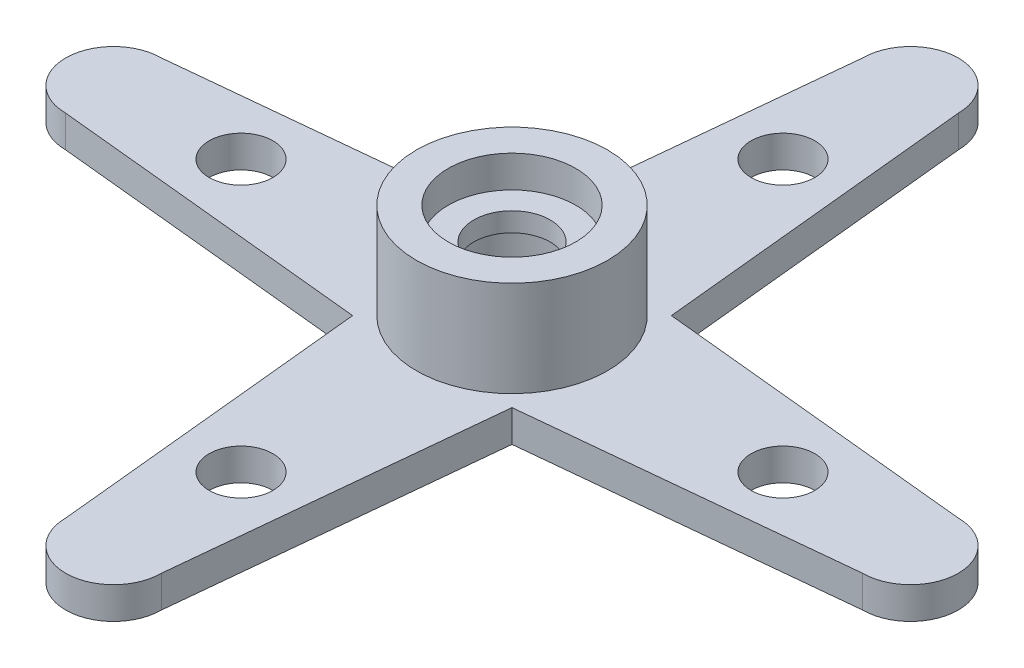
ISO-10303-21;
HEADER;
FILE_DESCRIPTION(('STEP AP214'),'2;1');
FILE_NAME('part.step','',(''),(''),'','','');
FILE_SCHEMA(('AUTOMOTIVE_DESIGN { 1 0 10303 214 1 1 1 1 }'));
ENDSEC;
DATA;
#1=APPLICATION_CONTEXT('core data for automotive mechanical design processes');
#2=APPLICATION_PROTOCOL_DEFINITION('international standard','automotive_design',2000,#1);
#3=PRODUCT_CONTEXT('',#1,'mechanical');
#4=PRODUCT('Part','Part','',(#3));
#5=PRODUCT_RELATED_PRODUCT_CATEGORY('part','',(#4));
#6=PRODUCT_DEFINITION_FORMATION('','',#4);
#7=PRODUCT_DEFINITION_CONTEXT('part definition',#1,'design');
#8=PRODUCT_DEFINITION('design','',#6,#7);
#9=PRODUCT_DEFINITION_SHAPE('','',#8);
#10=(LENGTH_UNIT() NAMED_UNIT(*) SI_UNIT(.MILLI.,.METRE.));
#11=(NAMED_UNIT(*) PLANE_ANGLE_UNIT() SI_UNIT($,.RADIAN.));
#12=(NAMED_UNIT(*) SI_UNIT($,.STERADIAN.) SOLID_ANGLE_UNIT());
#13=UNCERTAINTY_MEASURE_WITH_UNIT(LENGTH_MEASURE(1.E-05),#10,'distance_accuracy_value','');
#14=(GEOMETRIC_REPRESENTATION_CONTEXT(3) GLOBAL_UNCERTAINTY_ASSIGNED_CONTEXT((#13)) GLOBAL_UNIT_ASSIGNED_CONTEXT((#10,
#11,#12)) REPRESENTATION_CONTEXT('',''));
#15=CARTESIAN_POINT('',(0.,0.,0.));
#16=DIRECTION('',(0.,0.,1.));
#17=DIRECTION('',(1.,0.,0.));
#18=AXIS2_PLACEMENT_3D('',#15,#16,#17);
#19=CARTESIAN_POINT('',(0.,2.5,0.));
#20=DIRECTION('',(0.,-1.,0.));
#21=DIRECTION('',(0.,0.,-1.));
#22=AXIS2_PLACEMENT_3D('',#19,#20,#21);
#23=CYLINDRICAL_SURFACE('',#22,10.);
#24=CARTESIAN_POINT('',(0.,-2.5,0.));
#25=DIRECTION('',(0.,1.,0.));
#26=DIRECTION('',(0.,0.,1.));
#27=AXIS2_PLACEMENT_3D('',#24,#25,#26);
#28=CIRCLE('',#27,10.);
#29=CARTESIAN_POINT('',(0.,-2.5,10.));
#30=VERTEX_POINT('',#29);
#31=EDGE_CURVE('E163',#30,#30,#28,.T.);
#32=ORIENTED_EDGE('',*,*,#31,.F.);
#33=EDGE_LOOP('',(#32));
#34=FACE_BOUND('',#33,.T.);
#35=CARTESIAN_POINT('',(0.,9.5,0.));
#36=DIRECTION('',(0.,1.,0.));
#37=DIRECTION('',(0.,0.,1.));
#38=AXIS2_PLACEMENT_3D('',#35,#36,#37);
#39=CIRCLE('',#38,10.);
#40=CARTESIAN_POINT('',(0.,9.5,10.));
#41=VERTEX_POINT('',#40);
#42=EDGE_CURVE('E319',#41,#41,#39,.T.);
#43=ORIENTED_EDGE('',*,*,#42,.T.);
#44=EDGE_LOOP('',(#43));
#45=FACE_BOUND('',#44,.T.);
#46=ADVANCED_FACE('F36',(#34,#45),#23,.F.);
#47=CARTESIAN_POINT('',(62.5,2.5,0.));
#48=DIRECTION('',(0.,-1.,0.));
#49=DIRECTION('',(0.,0.,-1.));
#50=AXIS2_PLACEMENT_3D('',#47,#48,#49);
#51=PLANE('',#50);
#52=CARTESIAN_POINT('',(42.5,2.5,0.));
#53=DIRECTION('',(0.,1.,0.));
#54=DIRECTION('',(0.,0.,1.));
#55=AXIS2_PLACEMENT_3D('',#52,#53,#54);
#56=CIRCLE('',#55,5.);
#57=CARTESIAN_POINT('',(42.5,2.5,4.99999999999999));
#58=VERTEX_POINT('',#57);
#59=EDGE_CURVE('E334',#58,#58,#56,.T.);
#60=ORIENTED_EDGE('',*,*,#59,.F.);
#61=EDGE_LOOP('',(#60));
#62=FACE_BOUND('',#61,.T.);
#63=CARTESIAN_POINT('',(-42.5,2.5,0.));
#64=DIRECTION('',(0.,1.,0.));
#65=DIRECTION('',(0.,0.,1.));
#66=AXIS2_PLACEMENT_3D('',#63,#64,#65);
#67=CIRCLE('',#66,5.);
#68=CARTESIAN_POINT('',(-42.5,2.5,5.));
#69=VERTEX_POINT('',#68);
#70=EDGE_CURVE('E328',#69,#69,#67,.T.);
#71=ORIENTED_EDGE('',*,*,#70,.F.);
#72=EDGE_LOOP('',(#71));
#73=FACE_BOUND('',#72,.T.);
#74=CARTESIAN_POINT('',(0.,2.5,-42.5));
#75=DIRECTION('',(0.,1.,0.));
#76=DIRECTION('',(0.,0.,1.));
#77=AXIS2_PLACEMENT_3D('',#74,#75,#76);
#78=CIRCLE('',#77,5.);
#79=CARTESIAN_POINT('',(0.,2.5,-37.5));
#80=VERTEX_POINT('',#79);
#81=EDGE_CURVE('E322',#80,#80,#78,.T.);
#82=ORIENTED_EDGE('',*,*,#81,.F.);
#83=EDGE_LOOP('',(#82));
#84=FACE_BOUND('',#83,.T.);
#85=CARTESIAN_POINT('',(0.,2.5,42.5));
#86=DIRECTION('',(0.,1.,0.));
#87=DIRECTION('',(0.,0.,-1.));
#88=AXIS2_PLACEMENT_3D('',#85,#86,#87);
#89=CIRCLE('',#88,5.);
#90=CARTESIAN_POINT('',(0.,2.5,37.5));
#91=VERTEX_POINT('',#90);
#92=EDGE_CURVE('E315',#91,#91,#89,.T.);
#93=ORIENTED_EDGE('',*,*,#92,.F.);
#94=EDGE_LOOP('',(#93));
#95=FACE_BOUND('',#94,.T.);
#96=DIRECTION('',(-0.0995037190209994,0.,-0.995037190209989));
#97=VECTOR('',#96,1.);
#98=CARTESIAN_POINT('',(7.5,2.5,-62.5));
#99=LINE('',#98,#97);
#100=CARTESIAN_POINT('',(12.5,2.5,-12.5));
#101=VERTEX_POINT('',#100);
#102=CARTESIAN_POINT('',(7.5,2.5,-62.5));
#103=VERTEX_POINT('',#102);
#104=EDGE_CURVE('E182',#101,#103,#99,.T.);
#105=ORIENTED_EDGE('',*,*,#104,.T.);
#106=CARTESIAN_POINT('',(0.,2.5,-62.5));
#107=DIRECTION('',(0.,1.,0.));
#108=DIRECTION('',(0.,0.,-1.));
#109=AXIS2_PLACEMENT_3D('',#106,#107,#108);
#110=CIRCLE('',#109,7.5);
#111=CARTESIAN_POINT('',(-7.5,2.5,-62.5));
#112=VERTEX_POINT('',#111);
#113=EDGE_CURVE('E109',#103,#112,#110,.T.);
#114=ORIENTED_EDGE('',*,*,#113,.T.);
#115=DIRECTION('',(-0.0995037190209991,0.,0.995037190209989));
#116=VECTOR('',#115,1.);
#117=CARTESIAN_POINT('',(-7.5,2.5,-62.5));
#118=LINE('',#117,#116);
#119=CARTESIAN_POINT('',(-12.5,2.5,-12.5));
#120=VERTEX_POINT('',#119);
#121=EDGE_CURVE('E275',#112,#120,#118,.T.);
#122=ORIENTED_EDGE('',*,*,#121,.T.);
#123=DIRECTION('',(-0.995037190209989,0.,0.099503719020999));
#124=VECTOR('',#123,1.);
#125=CARTESIAN_POINT('',(-12.5,2.5,-12.5));
#126=LINE('',#125,#124);
#127=CARTESIAN_POINT('',(-62.5,2.5,-7.5));
#128=VERTEX_POINT('',#127);
#129=EDGE_CURVE('E287',#120,#128,#126,.T.);
#130=ORIENTED_EDGE('',*,*,#129,.T.);
#131=CARTESIAN_POINT('',(-62.5,2.5,0.));
#132=DIRECTION('',(0.,1.,0.));
#133=DIRECTION('',(0.,0.,-1.));
#134=AXIS2_PLACEMENT_3D('',#131,#132,#133);
#135=CIRCLE('',#134,7.5);
#136=CARTESIAN_POINT('',(-62.5,2.5,7.5));
#137=VERTEX_POINT('',#136);
#138=EDGE_CURVE('E284',#128,#137,#135,.T.);
#139=ORIENTED_EDGE('',*,*,#138,.T.);
#140=DIRECTION('',(0.995037190209989,0.,0.099503719020999));
#141=VECTOR('',#140,1.);
#142=CARTESIAN_POINT('',(-62.5,2.5,7.5));
#143=LINE('',#142,#141);
#144=CARTESIAN_POINT('',(-12.5,2.5,12.5));
#145=VERTEX_POINT('',#144);
#146=EDGE_CURVE('E286',#137,#145,#143,.T.);
#147=ORIENTED_EDGE('',*,*,#146,.T.);
#148=DIRECTION('',(0.0995037190209991,0.,0.995037190209989));
#149=VECTOR('',#148,1.);
#150=CARTESIAN_POINT('',(-7.50000000000001,2.5,62.5));
#151=LINE('',#150,#149);
#152=CARTESIAN_POINT('',(-7.5,2.5,62.5));
#153=VERTEX_POINT('',#152);
#154=EDGE_CURVE('E289',#145,#153,#151,.T.);
#155=ORIENTED_EDGE('',*,*,#154,.T.);
#156=CARTESIAN_POINT('',(0.,2.5,62.5));
#157=DIRECTION('',(0.,1.,0.));
#158=DIRECTION('',(0.,0.,1.));
#159=AXIS2_PLACEMENT_3D('',#156,#157,#158);
#160=CIRCLE('',#159,7.49999999999999);
#161=CARTESIAN_POINT('',(7.49999999999997,2.5,62.5));
#162=VERTEX_POINT('',#161);
#163=EDGE_CURVE('E295',#153,#162,#160,.T.);
#164=ORIENTED_EDGE('',*,*,#163,.T.);
#165=DIRECTION('',(0.0995037190209994,0.,-0.995037190209989));
#166=VECTOR('',#165,1.);
#167=CARTESIAN_POINT('',(7.49999999999997,2.5,62.5));
#168=LINE('',#167,#166);
#169=CARTESIAN_POINT('',(12.5,2.5,12.5));
#170=VERTEX_POINT('',#169);
#171=EDGE_CURVE('E141',#162,#170,#168,.T.);
#172=ORIENTED_EDGE('',*,*,#171,.T.);
#173=DIRECTION('',(0.995037190209989,0.,-0.099503719020999));
#174=VECTOR('',#173,1.);
#175=CARTESIAN_POINT('',(62.5,2.5,7.5));
#176=LINE('',#175,#174);
#177=CARTESIAN_POINT('',(62.5,2.5,7.5));
#178=VERTEX_POINT('',#177);
#179=EDGE_CURVE('E134',#170,#178,#176,.T.);
#180=ORIENTED_EDGE('',*,*,#179,.T.);
#181=CARTESIAN_POINT('',(62.5,2.5,0.));
#182=DIRECTION('',(0.,1.,0.));
#183=DIRECTION('',(0.,0.,-1.));
#184=AXIS2_PLACEMENT_3D('',#181,#182,#183);
#185=CIRCLE('',#184,7.5);
#186=CARTESIAN_POINT('',(62.5,2.5,-7.5));
#187=VERTEX_POINT('',#186);
#188=EDGE_CURVE('E139',#178,#187,#185,.T.);
#189=ORIENTED_EDGE('',*,*,#188,.T.);
#190=DIRECTION('',(-0.995037190209989,0.,-0.099503719020999));
#191=VECTOR('',#190,1.);
#192=CARTESIAN_POINT('',(12.5,2.5,-12.5));
#193=LINE('',#192,#191);
#194=EDGE_CURVE('E53',#187,#101,#193,.T.);
#195=ORIENTED_EDGE('',*,*,#194,.T.);
#196=EDGE_LOOP('',(#105,#114,#122,#130,#139,#147,#155,#164,#172,#180,#189,#195));
#197=FACE_BOUND('',#196,.T.);
#198=CARTESIAN_POINT('',(0.,2.5,0.));
#199=DIRECTION('',(0.,-1.,0.));
#200=DIRECTION('',(0.,0.,-1.));
#201=AXIS2_PLACEMENT_3D('',#198,#199,#200);
#202=CIRCLE('',#201,15.);
#203=CARTESIAN_POINT('',(0.,2.5,-15.));
#204=VERTEX_POINT('',#203);
#205=EDGE_CURVE('E45',#204,#204,#202,.F.);
#206=ORIENTED_EDGE('',*,*,#205,.F.);
#207=EDGE_LOOP('',(#206));
#208=FACE_BOUND('',#207,.T.);
#209=ADVANCED_FACE('F136',(#62,#73,#84,#95,#197,#208),#51,.F.);
#210=CARTESIAN_POINT('',(62.5,-2.5,0.));
#211=DIRECTION('',(0.,-1.,0.));
#212=DIRECTION('',(0.,0.,-1.));
#213=AXIS2_PLACEMENT_3D('',#210,#211,#212);
#214=PLANE('',#213);
#215=CARTESIAN_POINT('',(42.5,-2.5,0.));
#216=DIRECTION('',(0.,1.,0.));
#217=DIRECTION('',(0.,0.,1.));
#218=AXIS2_PLACEMENT_3D('',#215,#216,#217);
#219=CIRCLE('',#218,5.);
#220=CARTESIAN_POINT('',(42.5,-2.5,4.99999999999999));
#221=VERTEX_POINT('',#220);
#222=EDGE_CURVE('E314',#221,#221,#219,.T.);
#223=ORIENTED_EDGE('',*,*,#222,.T.);
#224=EDGE_LOOP('',(#223));
#225=FACE_BOUND('',#224,.T.);
#226=CARTESIAN_POINT('',(-42.5,-2.5,0.));
#227=DIRECTION('',(0.,1.,0.));
#228=DIRECTION('',(0.,0.,1.));
#229=AXIS2_PLACEMENT_3D('',#226,#227,#228);
#230=CIRCLE('',#229,5.);
#231=CARTESIAN_POINT('',(-42.5,-2.5,5.));
#232=VERTEX_POINT('',#231);
#233=EDGE_CURVE('E331',#232,#232,#230,.T.);
#234=ORIENTED_EDGE('',*,*,#233,.T.);
#235=EDGE_LOOP('',(#234));
#236=FACE_BOUND('',#235,.T.);
#237=CARTESIAN_POINT('',(0.,-2.5,-42.5));
#238=DIRECTION('',(0.,1.,0.));
#239=DIRECTION('',(0.,0.,1.));
#240=AXIS2_PLACEMENT_3D('',#237,#238,#239);
#241=CIRCLE('',#240,5.);
#242=CARTESIAN_POINT('',(0.,-2.5,-37.5));
#243=VERTEX_POINT('',#242);
#244=EDGE_CURVE('E325',#243,#243,#241,.T.);
#245=ORIENTED_EDGE('',*,*,#244,.T.);
#246=EDGE_LOOP('',(#245));
#247=FACE_BOUND('',#246,.T.);
#248=CARTESIAN_POINT('',(0.,-2.5,42.5));
#249=DIRECTION('',(0.,1.,0.));
#250=DIRECTION('',(0.,0.,-1.));
#251=AXIS2_PLACEMENT_3D('',#248,#249,#250);
#252=CIRCLE('',#251,5.);
#253=CARTESIAN_POINT('',(0.,-2.5,37.5));
#254=VERTEX_POINT('',#253);
#255=EDGE_CURVE('E318',#254,#254,#252,.T.);
#256=ORIENTED_EDGE('',*,*,#255,.T.);
#257=EDGE_LOOP('',(#256));
#258=FACE_BOUND('',#257,.T.);
#259=DIRECTION('',(-0.0995037190209994,0.,-0.995037190209989));
#260=VECTOR('',#259,1.);
#261=CARTESIAN_POINT('',(7.5,-2.5,-62.5));
#262=LINE('',#261,#260);
#263=CARTESIAN_POINT('',(12.5,-2.5,-12.5));
#264=VERTEX_POINT('',#263);
#265=CARTESIAN_POINT('',(7.5,-2.5,-62.5));
#266=VERTEX_POINT('',#265);
#267=EDGE_CURVE('E159',#264,#266,#262,.T.);
#268=ORIENTED_EDGE('',*,*,#267,.F.);
#269=DIRECTION('',(-0.995037190209989,0.,-0.099503719020999));
#270=VECTOR('',#269,1.);
#271=CARTESIAN_POINT('',(12.5,-2.5,-12.5));
#272=LINE('',#271,#270);
#273=CARTESIAN_POINT('',(62.5,-2.5,-7.5));
#274=VERTEX_POINT('',#273);
#275=EDGE_CURVE('E100',#274,#264,#272,.T.);
#276=ORIENTED_EDGE('',*,*,#275,.F.);
#277=CARTESIAN_POINT('',(62.5,-2.5,0.));
#278=DIRECTION('',(0.,1.,0.));
#279=DIRECTION('',(0.,0.,-1.));
#280=AXIS2_PLACEMENT_3D('',#277,#278,#279);
#281=CIRCLE('',#280,7.5);
#282=CARTESIAN_POINT('',(62.5,-2.5,7.5));
#283=VERTEX_POINT('',#282);
#284=EDGE_CURVE('E94',#283,#274,#281,.T.);
#285=ORIENTED_EDGE('',*,*,#284,.F.);
#286=DIRECTION('',(0.995037190209989,0.,-0.099503719020999));
#287=VECTOR('',#286,1.);
#288=CARTESIAN_POINT('',(62.5,-2.5,7.5));
#289=LINE('',#288,#287);
#290=CARTESIAN_POINT('',(12.5,-2.5,12.5));
#291=VERTEX_POINT('',#290);
#292=EDGE_CURVE('E149',#291,#283,#289,.T.);
#293=ORIENTED_EDGE('',*,*,#292,.F.);
#294=DIRECTION('',(0.0995037190209994,0.,-0.995037190209989));
#295=VECTOR('',#294,1.);
#296=CARTESIAN_POINT('',(7.49999999999997,-2.5,62.5));
#297=LINE('',#296,#295);
#298=CARTESIAN_POINT('',(7.49999999999997,-2.5,62.5));
#299=VERTEX_POINT('',#298);
#300=EDGE_CURVE('E177',#299,#291,#297,.T.);
#301=ORIENTED_EDGE('',*,*,#300,.F.);
#302=CARTESIAN_POINT('',(0.,-2.5,62.5));
#303=DIRECTION('',(0.,1.,0.));
#304=DIRECTION('',(0.,0.,1.));
#305=AXIS2_PLACEMENT_3D('',#302,#303,#304);
#306=CIRCLE('',#305,7.49999999999999);
#307=CARTESIAN_POINT('',(-7.5,-2.5,62.5));
#308=VERTEX_POINT('',#307);
#309=EDGE_CURVE('E175',#308,#299,#306,.T.);
#310=ORIENTED_EDGE('',*,*,#309,.F.);
#311=DIRECTION('',(0.0995037190209991,0.,0.995037190209989));
#312=VECTOR('',#311,1.);
#313=CARTESIAN_POINT('',(-7.50000000000001,-2.5,62.5));
#314=LINE('',#313,#312);
#315=CARTESIAN_POINT('',(-12.5,-2.5,12.5));
#316=VERTEX_POINT('',#315);
#317=EDGE_CURVE('E173',#316,#308,#314,.T.);
#318=ORIENTED_EDGE('',*,*,#317,.F.);
#319=DIRECTION('',(0.995037190209989,0.,0.099503719020999));
#320=VECTOR('',#319,1.);
#321=CARTESIAN_POINT('',(-62.5,-2.5,7.5));
#322=LINE('',#321,#320);
#323=CARTESIAN_POINT('',(-62.5,-2.5,7.5));
#324=VERTEX_POINT('',#323);
#325=EDGE_CURVE('E171',#324,#316,#322,.T.);
#326=ORIENTED_EDGE('',*,*,#325,.F.);
#327=CARTESIAN_POINT('',(-62.5,-2.5,0.));
#328=DIRECTION('',(0.,1.,0.));
#329=DIRECTION('',(0.,0.,-1.));
#330=AXIS2_PLACEMENT_3D('',#327,#328,#329);
#331=CIRCLE('',#330,7.5);
#332=CARTESIAN_POINT('',(-62.5,-2.5,-7.5));
#333=VERTEX_POINT('',#332);
#334=EDGE_CURVE('E169',#333,#324,#331,.T.);
#335=ORIENTED_EDGE('',*,*,#334,.F.);
#336=DIRECTION('',(-0.995037190209989,0.,0.099503719020999));
#337=VECTOR('',#336,1.);
#338=CARTESIAN_POINT('',(-12.5,-2.5,-12.5));
#339=LINE('',#338,#337);
#340=CARTESIAN_POINT('',(-12.5,-2.5,-12.5));
#341=VERTEX_POINT('',#340);
#342=EDGE_CURVE('E167',#341,#333,#339,.T.);
#343=ORIENTED_EDGE('',*,*,#342,.F.);
#344=DIRECTION('',(-0.0995037190209991,0.,0.995037190209989));
#345=VECTOR('',#344,1.);
#346=CARTESIAN_POINT('',(-7.5,-2.5,-62.5));
#347=LINE('',#346,#345);
#348=CARTESIAN_POINT('',(-7.5,-2.5,-62.5));
#349=VERTEX_POINT('',#348);
#350=EDGE_CURVE('E165',#349,#341,#347,.T.);
#351=ORIENTED_EDGE('',*,*,#350,.F.);
#352=CARTESIAN_POINT('',(0.,-2.5,-62.5));
#353=DIRECTION('',(0.,1.,0.));
#354=DIRECTION('',(0.,0.,-1.));
#355=AXIS2_PLACEMENT_3D('',#352,#353,#354);
#356=CIRCLE('',#355,7.5);
#357=EDGE_CURVE('E162',#266,#349,#356,.T.);
#358=ORIENTED_EDGE('',*,*,#357,.F.);
#359=EDGE_LOOP('',(#268,#276,#285,#293,#301,#310,#318,#326,#335,#343,#351,#358));
#360=FACE_BOUND('',#359,.T.);
#361=ORIENTED_EDGE('',*,*,#31,.T.);
#362=EDGE_LOOP('',(#361));
#363=FACE_BOUND('',#362,.T.);
#364=ADVANCED_FACE('F213',(#225,#236,#247,#258,#360,#363),#214,.T.);
#365=CARTESIAN_POINT('',(7.5,2.5,-62.5));
#366=DIRECTION('',(-0.995037190209989,0.,0.0995037190209994));
#367=DIRECTION('',(0.0995037190209994,0.,0.995037190209989));
#368=AXIS2_PLACEMENT_3D('',#365,#366,#367);
#369=PLANE('',#368);
#370=ORIENTED_EDGE('',*,*,#267,.T.);
#371=DIRECTION('',(0.,-1.,0.));
#372=VECTOR('',#371,1.);
#373=CARTESIAN_POINT('',(7.5,2.5,-62.5));
#374=LINE('',#373,#372);
#375=EDGE_CURVE('E207',#103,#266,#374,.T.);
#376=ORIENTED_EDGE('',*,*,#375,.F.);
#377=ORIENTED_EDGE('',*,*,#104,.F.);
#378=DIRECTION('',(0.,-1.,0.));
#379=VECTOR('',#378,1.);
#380=CARTESIAN_POINT('',(12.5,2.5,-12.5));
#381=LINE('',#380,#379);
#382=EDGE_CURVE('E155',#101,#264,#381,.T.);
#383=ORIENTED_EDGE('',*,*,#382,.T.);
#384=EDGE_LOOP('',(#370,#376,#377,#383));
#385=FACE_BOUND('',#384,.T.);
#386=ADVANCED_FACE('F38',(#385),#369,.F.);
#387=CARTESIAN_POINT('',(0.,2.5,-62.5));
#388=DIRECTION('',(0.,-1.,0.));
#389=DIRECTION('',(0.,0.,-1.));
#390=AXIS2_PLACEMENT_3D('',#387,#388,#389);
#391=CYLINDRICAL_SURFACE('',#390,7.5);
#392=ORIENTED_EDGE('',*,*,#357,.T.);
#393=DIRECTION('',(0.,-1.,0.));
#394=VECTOR('',#393,1.);
#395=CARTESIAN_POINT('',(-7.5,2.5,-62.5));
#396=LINE('',#395,#394);
#397=EDGE_CURVE('E204',#112,#349,#396,.T.);
#398=ORIENTED_EDGE('',*,*,#397,.F.);
#399=ORIENTED_EDGE('',*,*,#113,.F.);
#400=ORIENTED_EDGE('',*,*,#375,.T.);
#401=EDGE_LOOP('',(#392,#398,#399,#400));
#402=FACE_BOUND('',#401,.T.);
#403=ADVANCED_FACE('F262',(#402),#391,.T.);
#404=CARTESIAN_POINT('',(-7.5,2.5,-62.5));
#405=DIRECTION('',(0.995037190209989,0.,0.0995037190209991));
#406=DIRECTION('',(0.0995037190209991,0.,-0.995037190209989));
#407=AXIS2_PLACEMENT_3D('',#404,#405,#406);
#408=PLANE('',#407);
#409=ORIENTED_EDGE('',*,*,#350,.T.);
#410=DIRECTION('',(0.,-1.,0.));
#411=VECTOR('',#410,1.);
#412=CARTESIAN_POINT('',(-12.5,2.5,-12.5));
#413=LINE('',#412,#411);
#414=EDGE_CURVE('E201',#120,#341,#413,.T.);
#415=ORIENTED_EDGE('',*,*,#414,.F.);
#416=ORIENTED_EDGE('',*,*,#121,.F.);
#417=ORIENTED_EDGE('',*,*,#397,.T.);
#418=EDGE_LOOP('',(#409,#415,#416,#417));
#419=FACE_BOUND('',#418,.T.);
#420=ADVANCED_FACE('F259',(#419),#408,.F.);
#421=CARTESIAN_POINT('',(-12.5,2.5,-12.5));
#422=DIRECTION('',(0.099503719020999,0.,0.995037190209989));
#423=DIRECTION('',(0.995037190209989,0.,-0.099503719020999));
#424=AXIS2_PLACEMENT_3D('',#421,#422,#423);
#425=PLANE('',#424);
#426=ORIENTED_EDGE('',*,*,#342,.T.);
#427=DIRECTION('',(0.,-1.,0.));
#428=VECTOR('',#427,1.);
#429=CARTESIAN_POINT('',(-62.5,2.5,-7.5));
#430=LINE('',#429,#428);
#431=EDGE_CURVE('E198',#128,#333,#430,.T.);
#432=ORIENTED_EDGE('',*,*,#431,.F.);
#433=ORIENTED_EDGE('',*,*,#129,.F.);
#434=ORIENTED_EDGE('',*,*,#414,.T.);
#435=EDGE_LOOP('',(#426,#432,#433,#434));
#436=FACE_BOUND('',#435,.T.);
#437=ADVANCED_FACE('F255',(#436),#425,.F.);
#438=CARTESIAN_POINT('',(-62.5,2.5,0.));
#439=DIRECTION('',(0.,-1.,0.));
#440=DIRECTION('',(0.,0.,-1.));
#441=AXIS2_PLACEMENT_3D('',#438,#439,#440);
#442=CYLINDRICAL_SURFACE('',#441,7.5);
#443=ORIENTED_EDGE('',*,*,#334,.T.);
#444=DIRECTION('',(0.,-1.,0.));
#445=VECTOR('',#444,1.);
#446=CARTESIAN_POINT('',(-62.5,2.5,7.5));
#447=LINE('',#446,#445);
#448=EDGE_CURVE('E195',#137,#324,#447,.T.);
#449=ORIENTED_EDGE('',*,*,#448,.F.);
#450=ORIENTED_EDGE('',*,*,#138,.F.);
#451=ORIENTED_EDGE('',*,*,#431,.T.);
#452=EDGE_LOOP('',(#443,#449,#450,#451));
#453=FACE_BOUND('',#452,.T.);
#454=ADVANCED_FACE('F251',(#453),#442,.T.);
#455=CARTESIAN_POINT('',(-62.5,2.5,7.5));
#456=DIRECTION('',(0.099503719020999,0.,-0.995037190209989));
#457=DIRECTION('',(-0.995037190209989,0.,-0.099503719020999));
#458=AXIS2_PLACEMENT_3D('',#455,#456,#457);
#459=PLANE('',#458);
#460=ORIENTED_EDGE('',*,*,#325,.T.);
#461=DIRECTION('',(0.,-1.,0.));
#462=VECTOR('',#461,1.);
#463=CARTESIAN_POINT('',(-12.5,2.5,12.5));
#464=LINE('',#463,#462);
#465=EDGE_CURVE('E192',#145,#316,#464,.T.);
#466=ORIENTED_EDGE('',*,*,#465,.F.);
#467=ORIENTED_EDGE('',*,*,#146,.F.);
#468=ORIENTED_EDGE('',*,*,#448,.T.);
#469=EDGE_LOOP('',(#460,#466,#467,#468));
#470=FACE_BOUND('',#469,.T.);
#471=ADVANCED_FACE('F247',(#470),#459,.F.);
#472=CARTESIAN_POINT('',(-7.50000000000001,2.5,62.5));
#473=DIRECTION('',(0.995037190209989,0.,-0.0995037190209991));
#474=DIRECTION('',(-0.0995037190209991,0.,-0.995037190209989));
#475=AXIS2_PLACEMENT_3D('',#472,#473,#474);
#476=PLANE('',#475);
#477=ORIENTED_EDGE('',*,*,#317,.T.);
#478=DIRECTION('',(0.,-1.,0.));
#479=VECTOR('',#478,1.);
#480=CARTESIAN_POINT('',(-7.5,2.5,62.5));
#481=LINE('',#480,#479);
#482=EDGE_CURVE('E189',#153,#308,#481,.T.);
#483=ORIENTED_EDGE('',*,*,#482,.F.);
#484=ORIENTED_EDGE('',*,*,#154,.F.);
#485=ORIENTED_EDGE('',*,*,#465,.T.);
#486=EDGE_LOOP('',(#477,#483,#484,#485));
#487=FACE_BOUND('',#486,.T.);
#488=ADVANCED_FACE('F243',(#487),#476,.F.);
#489=CARTESIAN_POINT('',(0.,2.5,62.5));
#490=DIRECTION('',(0.,-1.,0.));
#491=DIRECTION('',(0.,0.,-1.));
#492=AXIS2_PLACEMENT_3D('',#489,#490,#491);
#493=CYLINDRICAL_SURFACE('',#492,7.49999999999999);
#494=ORIENTED_EDGE('',*,*,#309,.T.);
#495=DIRECTION('',(0.,-1.,0.));
#496=VECTOR('',#495,1.);
#497=CARTESIAN_POINT('',(7.49999999999997,2.5,62.5));
#498=LINE('',#497,#496);
#499=EDGE_CURVE('E186',#162,#299,#498,.T.);
#500=ORIENTED_EDGE('',*,*,#499,.F.);
#501=ORIENTED_EDGE('',*,*,#163,.F.);
#502=ORIENTED_EDGE('',*,*,#482,.T.);
#503=EDGE_LOOP('',(#494,#500,#501,#502));
#504=FACE_BOUND('',#503,.T.);
#505=ADVANCED_FACE('F239',(#504),#493,.T.);
#506=CARTESIAN_POINT('',(7.49999999999997,2.5,62.5));
#507=DIRECTION('',(-0.995037190209989,0.,-0.0995037190209994));
#508=DIRECTION('',(-0.0995037190209994,0.,0.995037190209989));
#509=AXIS2_PLACEMENT_3D('',#506,#507,#508);
#510=PLANE('',#509);
#511=ORIENTED_EDGE('',*,*,#300,.T.);
#512=DIRECTION('',(0.,-1.,0.));
#513=VECTOR('',#512,1.);
#514=CARTESIAN_POINT('',(12.5,2.5,12.5));
#515=LINE('',#514,#513);
#516=EDGE_CURVE('E150',#170,#291,#515,.T.);
#517=ORIENTED_EDGE('',*,*,#516,.F.);
#518=ORIENTED_EDGE('',*,*,#171,.F.);
#519=ORIENTED_EDGE('',*,*,#499,.T.);
#520=EDGE_LOOP('',(#511,#517,#518,#519));
#521=FACE_BOUND('',#520,.T.);
#522=ADVANCED_FACE('F236',(#521),#510,.F.);
#523=CARTESIAN_POINT('',(62.5,2.5,7.5));
#524=DIRECTION('',(-0.099503719020999,0.,-0.995037190209989));
#525=DIRECTION('',(-0.995037190209989,0.,0.099503719020999));
#526=AXIS2_PLACEMENT_3D('',#523,#524,#525);
#527=PLANE('',#526);
#528=ORIENTED_EDGE('',*,*,#292,.T.);
#529=DIRECTION('',(0.,-1.,0.));
#530=VECTOR('',#529,1.);
#531=CARTESIAN_POINT('',(62.5,2.5,7.5));
#532=LINE('',#531,#530);
#533=EDGE_CURVE('E146',#178,#283,#532,.T.);
#534=ORIENTED_EDGE('',*,*,#533,.F.);
#535=ORIENTED_EDGE('',*,*,#179,.F.);
#536=ORIENTED_EDGE('',*,*,#516,.T.);
#537=EDGE_LOOP('',(#528,#534,#535,#536));
#538=FACE_BOUND('',#537,.T.);
#539=ADVANCED_FACE('F147',(#538),#527,.F.);
#540=CARTESIAN_POINT('',(62.5,2.5,0.));
#541=DIRECTION('',(0.,-1.,0.));
#542=DIRECTION('',(0.,0.,-1.));
#543=AXIS2_PLACEMENT_3D('',#540,#541,#542);
#544=CYLINDRICAL_SURFACE('',#543,7.5);
#545=ORIENTED_EDGE('',*,*,#284,.T.);
#546=DIRECTION('',(0.,-1.,0.));
#547=VECTOR('',#546,1.);
#548=CARTESIAN_POINT('',(62.5,2.5,-7.5));
#549=LINE('',#548,#547);
#550=EDGE_CURVE('E151',#187,#274,#549,.T.);
#551=ORIENTED_EDGE('',*,*,#550,.F.);
#552=ORIENTED_EDGE('',*,*,#188,.F.);
#553=ORIENTED_EDGE('',*,*,#533,.T.);
#554=EDGE_LOOP('',(#545,#551,#552,#553));
#555=FACE_BOUND('',#554,.T.);
#556=ADVANCED_FACE('F153',(#555),#544,.T.);
#557=CARTESIAN_POINT('',(12.5,2.5,-12.5));
#558=DIRECTION('',(-0.099503719020999,0.,0.995037190209989));
#559=DIRECTION('',(0.995037190209989,0.,0.0995037190209991));
#560=AXIS2_PLACEMENT_3D('',#557,#558,#559);
#561=PLANE('',#560);
#562=ORIENTED_EDGE('',*,*,#275,.T.);
#563=ORIENTED_EDGE('',*,*,#382,.F.);
#564=ORIENTED_EDGE('',*,*,#194,.F.);
#565=ORIENTED_EDGE('',*,*,#550,.T.);
#566=EDGE_LOOP('',(#562,#563,#564,#565));
#567=FACE_BOUND('',#566,.T.);
#568=ADVANCED_FACE('F229',(#567),#561,.F.);
#569=CARTESIAN_POINT('',(0.,12.5,0.));
#570=DIRECTION('',(0.,1.,0.));
#571=DIRECTION('',(0.,0.,1.));
#572=AXIS2_PLACEMENT_3D('',#569,#570,#571);
#573=CIRCLE('',#572,10.);
#574=CARTESIAN_POINT('',(0.,12.5,10.));
#575=VERTEX_POINT('',#574);
#576=EDGE_CURVE('E11',#575,#575,#573,.T.);
#577=ORIENTED_EDGE('',*,*,#576,.F.);
#578=EDGE_LOOP('',(#577));
#579=FACE_BOUND('',#578,.T.);
#580=CARTESIAN_POINT('',(0.,17.5,0.));
#581=DIRECTION('',(0.,1.,0.));
#582=DIRECTION('',(0.,0.,1.));
#583=AXIS2_PLACEMENT_3D('',#580,#581,#582);
#584=CIRCLE('',#583,10.);
#585=CARTESIAN_POINT('',(0.,17.5,10.));
#586=VERTEX_POINT('',#585);
#587=EDGE_CURVE('E311',#586,#586,#584,.T.);
#588=ORIENTED_EDGE('',*,*,#587,.T.);
#589=EDGE_LOOP('',(#588));
#590=FACE_BOUND('',#589,.T.);
#591=ADVANCED_FACE('F224',(#579,#590),#23,.F.);
#592=CARTESIAN_POINT('',(0.,17.5,0.));
#593=DIRECTION('',(0.,1.,0.));
#594=DIRECTION('',(0.,0.,1.));
#595=AXIS2_PLACEMENT_3D('',#592,#593,#594);
#596=PLANE('',#595);
#597=CARTESIAN_POINT('',(0.,17.5,0.));
#598=DIRECTION('',(0.,1.,0.));
#599=DIRECTION('',(0.,0.,1.));
#600=AXIS2_PLACEMENT_3D('',#597,#598,#599);
#601=CIRCLE('',#600,15.);
#602=CARTESIAN_POINT('',(0.,17.5,15.));
#603=VERTEX_POINT('',#602);
#604=EDGE_CURVE('E308',#603,#603,#601,.T.);
#605=ORIENTED_EDGE('',*,*,#604,.T.);
#606=EDGE_LOOP('',(#605));
#607=FACE_BOUND('',#606,.T.);
#608=ORIENTED_EDGE('',*,*,#587,.F.);
#609=EDGE_LOOP('',(#608));
#610=FACE_BOUND('',#609,.T.);
#611=ADVANCED_FACE('F379',(#607,#610),#596,.T.);
#612=CARTESIAN_POINT('',(0.,17.5,0.));
#613=DIRECTION('',(0.,-1.,0.));
#614=DIRECTION('',(0.,0.,-1.));
#615=AXIS2_PLACEMENT_3D('',#612,#613,#614);
#616=CYLINDRICAL_SURFACE('',#615,15.);
#617=ORIENTED_EDGE('',*,*,#604,.F.);
#618=EDGE_LOOP('',(#617));
#619=FACE_BOUND('',#618,.T.);
#620=ORIENTED_EDGE('',*,*,#205,.T.);
#621=EDGE_LOOP('',(#620));
#622=FACE_BOUND('',#621,.T.);
#623=ADVANCED_FACE('F211',(#619,#622),#616,.T.);
#624=CARTESIAN_POINT('',(0.,-2.5,42.5));
#625=DIRECTION('',(0.,1.,0.));
#626=DIRECTION('',(0.,0.,1.));
#627=AXIS2_PLACEMENT_3D('',#624,#625,#626);
#628=CYLINDRICAL_SURFACE('',#627,5.);
#629=ORIENTED_EDGE('',*,*,#255,.F.);
#630=EDGE_LOOP('',(#629));
#631=FACE_BOUND('',#630,.T.);
#632=ORIENTED_EDGE('',*,*,#92,.T.);
#633=EDGE_LOOP('',(#632));
#634=FACE_BOUND('',#633,.T.);
#635=ADVANCED_FACE('F374',(#631,#634),#628,.F.);
#636=CARTESIAN_POINT('',(0.,-2.5,-42.5));
#637=DIRECTION('',(0.,1.,0.));
#638=DIRECTION('',(0.,0.,1.));
#639=AXIS2_PLACEMENT_3D('',#636,#637,#638);
#640=CYLINDRICAL_SURFACE('',#639,5.);
#641=ORIENTED_EDGE('',*,*,#244,.F.);
#642=EDGE_LOOP('',(#641));
#643=FACE_BOUND('',#642,.T.);
#644=ORIENTED_EDGE('',*,*,#81,.T.);
#645=EDGE_LOOP('',(#644));
#646=FACE_BOUND('',#645,.T.);
#647=ADVANCED_FACE('F370',(#643,#646),#640,.F.);
#648=CARTESIAN_POINT('',(-42.5,-2.5,0.));
#649=DIRECTION('',(0.,1.,0.));
#650=DIRECTION('',(0.,0.,1.));
#651=AXIS2_PLACEMENT_3D('',#648,#649,#650);
#652=CYLINDRICAL_SURFACE('',#651,5.);
#653=ORIENTED_EDGE('',*,*,#233,.F.);
#654=EDGE_LOOP('',(#653));
#655=FACE_BOUND('',#654,.T.);
#656=ORIENTED_EDGE('',*,*,#70,.T.);
#657=EDGE_LOOP('',(#656));
#658=FACE_BOUND('',#657,.T.);
#659=ADVANCED_FACE('F363',(#655,#658),#652,.F.);
#660=CARTESIAN_POINT('',(42.5,-2.5,0.));
#661=DIRECTION('',(0.,1.,0.));
#662=DIRECTION('',(0.,0.,1.));
#663=AXIS2_PLACEMENT_3D('',#660,#661,#662);
#664=CYLINDRICAL_SURFACE('',#663,5.);
#665=ORIENTED_EDGE('',*,*,#222,.F.);
#666=EDGE_LOOP('',(#665));
#667=FACE_BOUND('',#666,.T.);
#668=ORIENTED_EDGE('',*,*,#59,.T.);
#669=EDGE_LOOP('',(#668));
#670=FACE_BOUND('',#669,.T.);
#671=ADVANCED_FACE('F354',(#667,#670),#664,.F.);
#672=CARTESIAN_POINT('',(0.,12.5,0.));
#673=DIRECTION('',(0.,1.,0.));
#674=DIRECTION('',(0.,0.,1.));
#675=AXIS2_PLACEMENT_3D('',#672,#673,#674);
#676=PLANE('',#675);
#677=ORIENTED_EDGE('',*,*,#576,.T.);
#678=EDGE_LOOP('',(#677));
#679=FACE_BOUND('',#678,.T.);
#680=CARTESIAN_POINT('',(0.,12.5,0.));
#681=DIRECTION('',(0.,1.,0.));
#682=DIRECTION('',(0.,0.,1.));
#683=AXIS2_PLACEMENT_3D('',#680,#681,#682);
#684=CIRCLE('',#683,6.);
#685=CARTESIAN_POINT('',(0.,12.5,6.));
#686=VERTEX_POINT('',#685);
#687=EDGE_CURVE('E341',#686,#686,#684,.T.);
#688=ORIENTED_EDGE('',*,*,#687,.F.);
#689=EDGE_LOOP('',(#688));
#690=FACE_BOUND('',#689,.T.);
#691=ADVANCED_FACE('F351',(#679,#690),#676,.T.);
#692=CARTESIAN_POINT('',(0.,9.5,0.));
#693=DIRECTION('',(0.,1.,0.));
#694=DIRECTION('',(0.,0.,1.));
#695=AXIS2_PLACEMENT_3D('',#692,#693,#694);
#696=PLANE('',#695);
#697=ORIENTED_EDGE('',*,*,#42,.F.);
#698=EDGE_LOOP('',(#697));
#699=FACE_BOUND('',#698,.T.);
#700=CARTESIAN_POINT('',(0.,9.5,0.));
#701=DIRECTION('',(0.,1.,0.));
#702=DIRECTION('',(0.,0.,1.));
#703=AXIS2_PLACEMENT_3D('',#700,#701,#702);
#704=CIRCLE('',#703,6.);
#705=CARTESIAN_POINT('',(0.,9.5,6.));
#706=VERTEX_POINT('',#705);
#707=EDGE_CURVE('E342',#706,#706,#704,.T.);
#708=ORIENTED_EDGE('',*,*,#707,.T.);
#709=EDGE_LOOP('',(#708));
#710=FACE_BOUND('',#709,.T.);
#711=ADVANCED_FACE('F353',(#699,#710),#696,.F.);
#712=CARTESIAN_POINT('',(0.,12.5,0.));
#713=DIRECTION('',(0.,-1.,0.));
#714=DIRECTION('',(0.,0.,-1.));
#715=AXIS2_PLACEMENT_3D('',#712,#713,#714);
#716=CYLINDRICAL_SURFACE('',#715,6.);
#717=ORIENTED_EDGE('',*,*,#687,.T.);
#718=EDGE_LOOP('',(#717));
#719=FACE_BOUND('',#718,.T.);
#720=ORIENTED_EDGE('',*,*,#707,.F.);
#721=EDGE_LOOP('',(#720));
#722=FACE_BOUND('',#721,.T.);
#723=ADVANCED_FACE('F348',(#719,#722),#716,.F.);
#724=CLOSED_SHELL('',(#46,#209,#364,#386,#403,#420,#437,#454,#471,#488,#505,#522,#539,#556,#568,
#591,#611,#623,#635,#647,#659,#671,#691,#711,#723));
#725=MANIFOLD_SOLID_BREP('B2',#724);
#726=ADVANCED_BREP_SHAPE_REPRESENTATION('',(#18,#725),#14);
#727=SHAPE_DEFINITION_REPRESENTATION(#9,#726);
ENDSEC;
END-ISO-10303-21;
